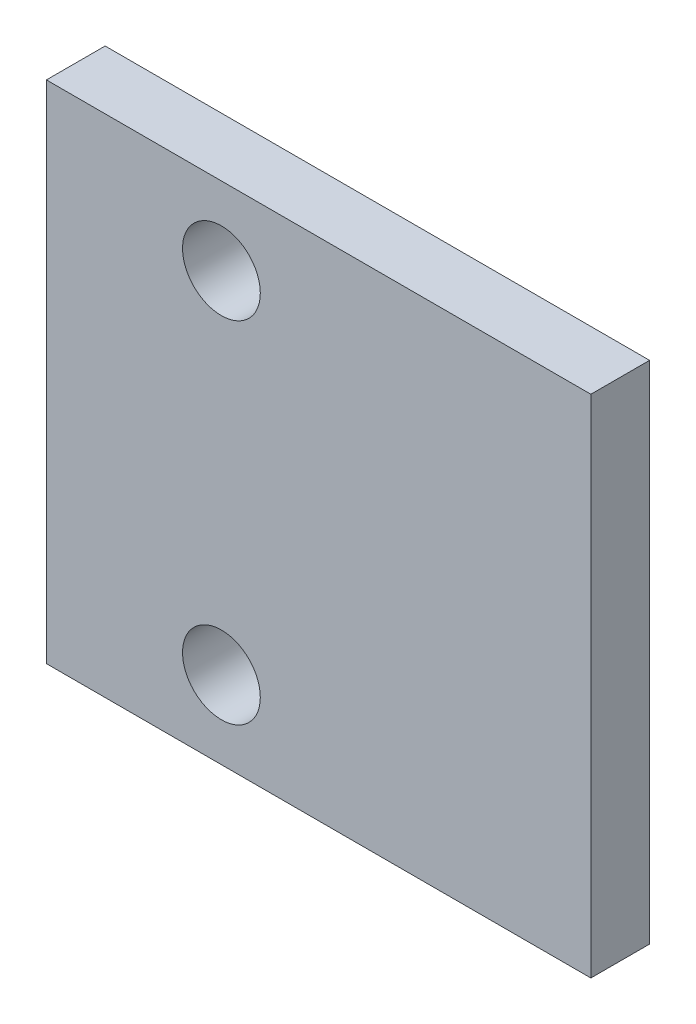
ISO-10303-21;
HEADER;
FILE_DESCRIPTION(('STEP AP214'),'2;1');
FILE_NAME('part.step','',(''),(''),'','','');
FILE_SCHEMA(('AUTOMOTIVE_DESIGN { 1 0 10303 214 1 1 1 1 }'));
ENDSEC;
DATA;
#1=APPLICATION_CONTEXT('core data for automotive mechanical design processes');
#2=APPLICATION_PROTOCOL_DEFINITION('international standard','automotive_design',2000,#1);
#3=PRODUCT_CONTEXT('',#1,'mechanical');
#4=PRODUCT('Part','Part','',(#3));
#5=PRODUCT_RELATED_PRODUCT_CATEGORY('part','',(#4));
#6=PRODUCT_DEFINITION_FORMATION('','',#4);
#7=PRODUCT_DEFINITION_CONTEXT('part definition',#1,'design');
#8=PRODUCT_DEFINITION('design','',#6,#7);
#9=PRODUCT_DEFINITION_SHAPE('','',#8);
#10=(LENGTH_UNIT() NAMED_UNIT(*) SI_UNIT(.MILLI.,.METRE.));
#11=(NAMED_UNIT(*) PLANE_ANGLE_UNIT() SI_UNIT($,.RADIAN.));
#12=(NAMED_UNIT(*) SI_UNIT($,.STERADIAN.) SOLID_ANGLE_UNIT());
#13=UNCERTAINTY_MEASURE_WITH_UNIT(LENGTH_MEASURE(1.E-05),#10,'distance_accuracy_value','');
#14=(GEOMETRIC_REPRESENTATION_CONTEXT(3) GLOBAL_UNCERTAINTY_ASSIGNED_CONTEXT((#13)) GLOBAL_UNIT_ASSIGNED_CONTEXT((#10,
#11,#12)) REPRESENTATION_CONTEXT('',''));
#15=CARTESIAN_POINT('',(0.,0.,0.));
#16=DIRECTION('',(0.,0.,1.));
#17=DIRECTION('',(1.,0.,0.));
#18=AXIS2_PLACEMENT_3D('',#15,#16,#17);
#19=CARTESIAN_POINT('',(0.,0.,1.51));
#20=DIRECTION('',(0.,0.,1.));
#21=DIRECTION('',(1.,0.,0.));
#22=AXIS2_PLACEMENT_3D('',#19,#20,#21);
#23=PLANE('',#22);
#24=CARTESIAN_POINT('',(153.5,-92.5,1.51));
#25=DIRECTION('',(0.,0.,1.));
#26=DIRECTION('',(1.,0.,0.));
#27=AXIS2_PLACEMENT_3D('',#24,#25,#26);
#28=CIRCLE('',#27,1.);
#29=CARTESIAN_POINT('',(154.5,-92.5,1.51));
#30=VERTEX_POINT('',#29);
#31=EDGE_CURVE('E25',#30,#30,#28,.T.);
#32=ORIENTED_EDGE('',*,*,#31,.F.);
#33=EDGE_LOOP('',(#32));
#34=FACE_BOUND('',#33,.T.);
#35=CARTESIAN_POINT('',(153.5,-101.5,1.51));
#36=DIRECTION('',(0.,0.,1.));
#37=DIRECTION('',(1.,0.,0.));
#38=AXIS2_PLACEMENT_3D('',#35,#36,#37);
#39=CIRCLE('',#38,1.);
#40=CARTESIAN_POINT('',(154.5,-101.5,1.51));
#41=VERTEX_POINT('',#40);
#42=EDGE_CURVE('E124',#41,#41,#39,.T.);
#43=ORIENTED_EDGE('',*,*,#42,.F.);
#44=EDGE_LOOP('',(#43));
#45=FACE_BOUND('',#44,.T.);
#46=DIRECTION('',(0.,-1.,0.));
#47=VECTOR('',#46,1.);
#48=CARTESIAN_POINT('',(163.,-90.5,1.51));
#49=LINE('',#48,#47);
#50=CARTESIAN_POINT('',(163.,-90.5,1.51));
#51=VERTEX_POINT('',#50);
#52=CARTESIAN_POINT('',(163.,-103.5,1.51));
#53=VERTEX_POINT('',#52);
#54=EDGE_CURVE('E76',#51,#53,#49,.T.);
#55=ORIENTED_EDGE('',*,*,#54,.F.);
#56=DIRECTION('',(1.,0.,0.));
#57=VECTOR('',#56,1.);
#58=CARTESIAN_POINT('',(149.,-90.5,1.51));
#59=LINE('',#58,#57);
#60=CARTESIAN_POINT('',(149.,-90.5,1.51));
#61=VERTEX_POINT('',#60);
#62=EDGE_CURVE('E129',#61,#51,#59,.T.);
#63=ORIENTED_EDGE('',*,*,#62,.F.);
#64=DIRECTION('',(0.,1.,0.));
#65=VECTOR('',#64,1.);
#66=CARTESIAN_POINT('',(149.,-103.5,1.51));
#67=LINE('',#66,#65);
#68=CARTESIAN_POINT('',(149.,-103.5,1.51));
#69=VERTEX_POINT('',#68);
#70=EDGE_CURVE('E112',#69,#61,#67,.T.);
#71=ORIENTED_EDGE('',*,*,#70,.F.);
#72=DIRECTION('',(-1.,0.,0.));
#73=VECTOR('',#72,1.);
#74=CARTESIAN_POINT('',(163.,-103.5,1.51));
#75=LINE('',#74,#73);
#76=EDGE_CURVE('E116',#53,#69,#75,.T.);
#77=ORIENTED_EDGE('',*,*,#76,.F.);
#78=EDGE_LOOP('',(#55,#63,#71,#77));
#79=FACE_BOUND('',#78,.T.);
#80=ADVANCED_FACE('F17',(#34,#45,#79),#23,.T.);
#81=CARTESIAN_POINT('',(0.,0.,0.));
#82=DIRECTION('',(0.,0.,1.));
#83=DIRECTION('',(1.,0.,0.));
#84=AXIS2_PLACEMENT_3D('',#81,#82,#83);
#85=PLANE('',#84);
#86=CARTESIAN_POINT('',(153.5,-92.5,0.));
#87=DIRECTION('',(0.,0.,1.));
#88=DIRECTION('',(1.,0.,0.));
#89=AXIS2_PLACEMENT_3D('',#86,#87,#88);
#90=CIRCLE('',#89,1.);
#91=CARTESIAN_POINT('',(154.5,-92.5,0.));
#92=VERTEX_POINT('',#91);
#93=EDGE_CURVE('E11',#92,#92,#90,.T.);
#94=ORIENTED_EDGE('',*,*,#93,.T.);
#95=EDGE_LOOP('',(#94));
#96=FACE_BOUND('',#95,.T.);
#97=CARTESIAN_POINT('',(153.5,-101.5,0.));
#98=DIRECTION('',(0.,0.,1.));
#99=DIRECTION('',(1.,0.,0.));
#100=AXIS2_PLACEMENT_3D('',#97,#98,#99);
#101=CIRCLE('',#100,1.);
#102=CARTESIAN_POINT('',(154.5,-101.5,0.));
#103=VERTEX_POINT('',#102);
#104=EDGE_CURVE('E135',#103,#103,#101,.T.);
#105=ORIENTED_EDGE('',*,*,#104,.T.);
#106=EDGE_LOOP('',(#105));
#107=FACE_BOUND('',#106,.T.);
#108=DIRECTION('',(-1.,0.,0.));
#109=VECTOR('',#108,1.);
#110=CARTESIAN_POINT('',(163.,-103.5,0.));
#111=LINE('',#110,#109);
#112=CARTESIAN_POINT('',(163.,-103.5,0.));
#113=VERTEX_POINT('',#112);
#114=CARTESIAN_POINT('',(149.,-103.5,0.));
#115=VERTEX_POINT('',#114);
#116=EDGE_CURVE('E97',#113,#115,#111,.T.);
#117=ORIENTED_EDGE('',*,*,#116,.T.);
#118=DIRECTION('',(0.,1.,0.));
#119=VECTOR('',#118,1.);
#120=CARTESIAN_POINT('',(149.,-103.5,0.));
#121=LINE('',#120,#119);
#122=CARTESIAN_POINT('',(149.,-90.5,0.));
#123=VERTEX_POINT('',#122);
#124=EDGE_CURVE('E126',#115,#123,#121,.T.);
#125=ORIENTED_EDGE('',*,*,#124,.T.);
#126=DIRECTION('',(1.,0.,0.));
#127=VECTOR('',#126,1.);
#128=CARTESIAN_POINT('',(149.,-90.5,0.));
#129=LINE('',#128,#127);
#130=CARTESIAN_POINT('',(163.,-90.5,0.));
#131=VERTEX_POINT('',#130);
#132=EDGE_CURVE('E99',#123,#131,#129,.T.);
#133=ORIENTED_EDGE('',*,*,#132,.T.);
#134=DIRECTION('',(0.,-1.,0.));
#135=VECTOR('',#134,1.);
#136=CARTESIAN_POINT('',(163.,-90.5,0.));
#137=LINE('',#136,#135);
#138=EDGE_CURVE('E63',#131,#113,#137,.T.);
#139=ORIENTED_EDGE('',*,*,#138,.T.);
#140=EDGE_LOOP('',(#117,#125,#133,#139));
#141=FACE_BOUND('',#140,.T.);
#142=ADVANCED_FACE('F95',(#96,#107,#141),#85,.F.);
#143=CARTESIAN_POINT('',(153.5,-92.5,0.));
#144=DIRECTION('',(0.,0.,-1.));
#145=DIRECTION('',(1.,0.,0.));
#146=AXIS2_PLACEMENT_3D('',#143,#144,#145);
#147=CYLINDRICAL_SURFACE('',#146,1.);
#148=DIRECTION('',(0.,0.,1.));
#149=VECTOR('',#148,1.);
#150=CARTESIAN_POINT('',(154.5,-92.5,0.));
#151=LINE('',#150,#149);
#152=EDGE_CURVE('E154',#92,#30,#151,.T.);
#153=ORIENTED_EDGE('',*,*,#152,.T.);
#154=ORIENTED_EDGE('',*,*,#31,.T.);
#155=ORIENTED_EDGE('',*,*,#152,.F.);
#156=ORIENTED_EDGE('',*,*,#93,.F.);
#157=EDGE_LOOP('',(#153,#154,#155,#156));
#158=FACE_BOUND('',#157,.T.);
#159=ADVANCED_FACE('F190',(#158),#147,.F.);
#160=CARTESIAN_POINT('',(153.5,-101.5,0.));
#161=DIRECTION('',(0.,0.,-1.));
#162=DIRECTION('',(1.,0.,0.));
#163=AXIS2_PLACEMENT_3D('',#160,#161,#162);
#164=CYLINDRICAL_SURFACE('',#163,1.);
#165=DIRECTION('',(0.,0.,1.));
#166=VECTOR('',#165,1.);
#167=CARTESIAN_POINT('',(154.5,-101.5,0.));
#168=LINE('',#167,#166);
#169=EDGE_CURVE('E102',#103,#41,#168,.T.);
#170=ORIENTED_EDGE('',*,*,#169,.T.);
#171=ORIENTED_EDGE('',*,*,#42,.T.);
#172=ORIENTED_EDGE('',*,*,#169,.F.);
#173=ORIENTED_EDGE('',*,*,#104,.F.);
#174=EDGE_LOOP('',(#170,#171,#172,#173));
#175=FACE_BOUND('',#174,.T.);
#176=ADVANCED_FACE('F195',(#175),#164,.F.);
#177=CARTESIAN_POINT('',(163.,-90.5,0.));
#178=DIRECTION('',(1.,0.,0.));
#179=DIRECTION('',(0.,1.,0.));
#180=AXIS2_PLACEMENT_3D('',#177,#178,#179);
#181=PLANE('',#180);
#182=DIRECTION('',(0.,0.,1.));
#183=VECTOR('',#182,1.);
#184=CARTESIAN_POINT('',(163.,-90.5,0.));
#185=LINE('',#184,#183);
#186=EDGE_CURVE('E145',#131,#51,#185,.T.);
#187=ORIENTED_EDGE('',*,*,#186,.T.);
#188=ORIENTED_EDGE('',*,*,#54,.T.);
#189=DIRECTION('',(0.,0.,1.));
#190=VECTOR('',#189,1.);
#191=CARTESIAN_POINT('',(163.,-103.5,0.));
#192=LINE('',#191,#190);
#193=EDGE_CURVE('E108',#113,#53,#192,.T.);
#194=ORIENTED_EDGE('',*,*,#193,.F.);
#195=ORIENTED_EDGE('',*,*,#138,.F.);
#196=EDGE_LOOP('',(#187,#188,#194,#195));
#197=FACE_BOUND('',#196,.T.);
#198=ADVANCED_FACE('F114',(#197),#181,.T.);
#199=CARTESIAN_POINT('',(149.,-90.5,0.));
#200=DIRECTION('',(0.,1.,0.));
#201=DIRECTION('',(1.,0.,0.));
#202=AXIS2_PLACEMENT_3D('',#199,#200,#201);
#203=PLANE('',#202);
#204=DIRECTION('',(0.,0.,1.));
#205=VECTOR('',#204,1.);
#206=CARTESIAN_POINT('',(149.,-90.5,0.));
#207=LINE('',#206,#205);
#208=EDGE_CURVE('E130',#123,#61,#207,.T.);
#209=ORIENTED_EDGE('',*,*,#208,.T.);
#210=ORIENTED_EDGE('',*,*,#62,.T.);
#211=ORIENTED_EDGE('',*,*,#186,.F.);
#212=ORIENTED_EDGE('',*,*,#132,.F.);
#213=EDGE_LOOP('',(#209,#210,#211,#212));
#214=FACE_BOUND('',#213,.T.);
#215=ADVANCED_FACE('F163',(#214),#203,.T.);
#216=CARTESIAN_POINT('',(149.,-103.5,0.));
#217=DIRECTION('',(-1.,0.,0.));
#218=DIRECTION('',(0.,0.,1.));
#219=AXIS2_PLACEMENT_3D('',#216,#217,#218);
#220=PLANE('',#219);
#221=DIRECTION('',(0.,0.,1.));
#222=VECTOR('',#221,1.);
#223=CARTESIAN_POINT('',(149.,-103.5,0.));
#224=LINE('',#223,#222);
#225=EDGE_CURVE('E110',#115,#69,#224,.T.);
#226=ORIENTED_EDGE('',*,*,#225,.T.);
#227=ORIENTED_EDGE('',*,*,#70,.T.);
#228=ORIENTED_EDGE('',*,*,#208,.F.);
#229=ORIENTED_EDGE('',*,*,#124,.F.);
#230=EDGE_LOOP('',(#226,#227,#228,#229));
#231=FACE_BOUND('',#230,.T.);
#232=ADVANCED_FACE('F168',(#231),#220,.T.);
#233=CARTESIAN_POINT('',(163.,-103.5,0.));
#234=DIRECTION('',(0.,-1.,0.));
#235=DIRECTION('',(0.,0.,-1.));
#236=AXIS2_PLACEMENT_3D('',#233,#234,#235);
#237=PLANE('',#236);
#238=ORIENTED_EDGE('',*,*,#193,.T.);
#239=ORIENTED_EDGE('',*,*,#76,.T.);
#240=ORIENTED_EDGE('',*,*,#225,.F.);
#241=ORIENTED_EDGE('',*,*,#116,.F.);
#242=EDGE_LOOP('',(#238,#239,#240,#241));
#243=FACE_BOUND('',#242,.T.);
#244=ADVANCED_FACE('F106',(#243),#237,.T.);
#245=CLOSED_SHELL('',(#80,#142,#159,#176,#198,#215,#232,#244));
#246=MANIFOLD_SOLID_BREP('B1',#245);
#247=ADVANCED_BREP_SHAPE_REPRESENTATION('',(#18,#246),#14);
#248=SHAPE_DEFINITION_REPRESENTATION(#9,#247);
ENDSEC;
END-ISO-10303-21;
